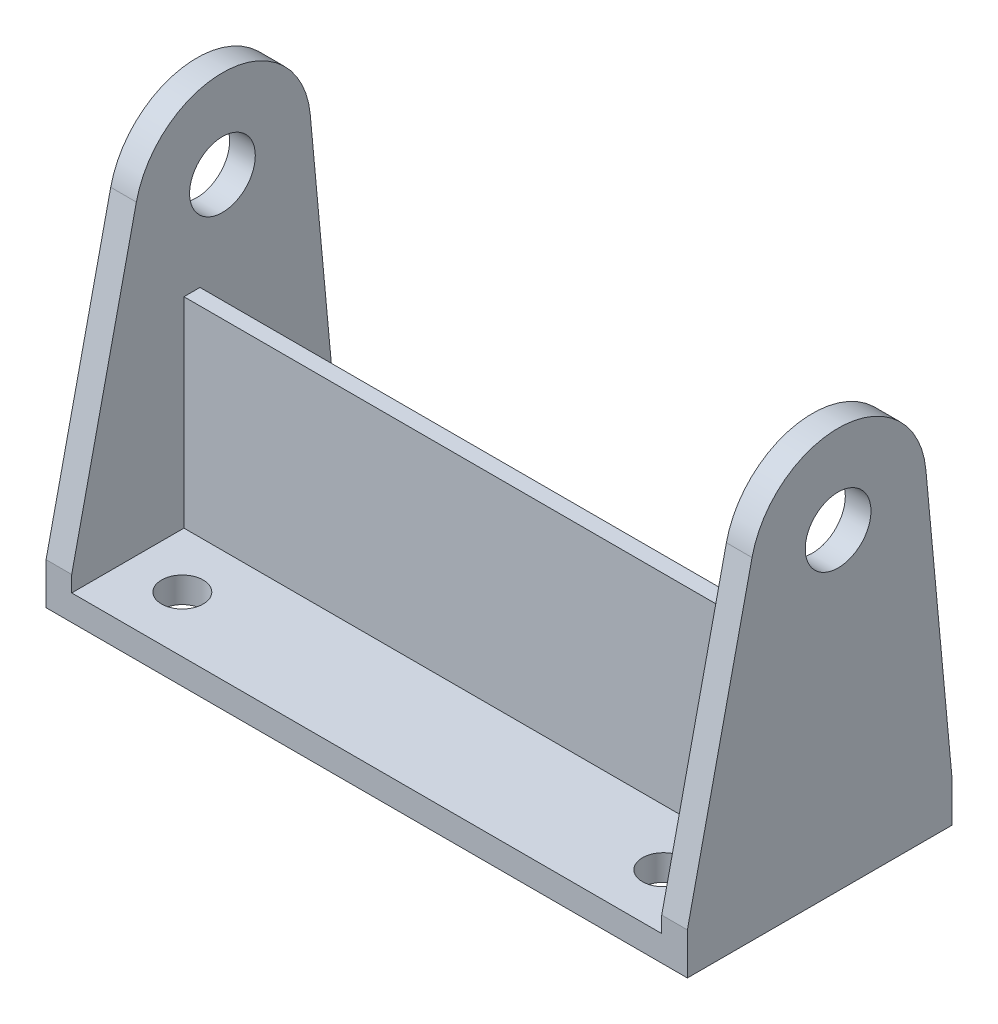
ISO-10303-21;
HEADER;
FILE_DESCRIPTION(('STEP AP214'),'2;1');
FILE_NAME('part.step','',(''),(''),'','','');
FILE_SCHEMA(('AUTOMOTIVE_DESIGN { 1 0 10303 214 1 1 1 1 }'));
ENDSEC;
DATA;
#1=APPLICATION_CONTEXT('core data for automotive mechanical design processes');
#2=APPLICATION_PROTOCOL_DEFINITION('international standard','automotive_design',2000,#1);
#3=PRODUCT_CONTEXT('',#1,'mechanical');
#4=PRODUCT('Part','Part','',(#3));
#5=PRODUCT_RELATED_PRODUCT_CATEGORY('part','',(#4));
#6=PRODUCT_DEFINITION_FORMATION('','',#4);
#7=PRODUCT_DEFINITION_CONTEXT('part definition',#1,'design');
#8=PRODUCT_DEFINITION('design','',#6,#7);
#9=PRODUCT_DEFINITION_SHAPE('','',#8);
#10=(LENGTH_UNIT() NAMED_UNIT(*) SI_UNIT(.MILLI.,.METRE.));
#11=(NAMED_UNIT(*) PLANE_ANGLE_UNIT() SI_UNIT($,.RADIAN.));
#12=(NAMED_UNIT(*) SI_UNIT($,.STERADIAN.) SOLID_ANGLE_UNIT());
#13=UNCERTAINTY_MEASURE_WITH_UNIT(LENGTH_MEASURE(1.E-05),#10,'distance_accuracy_value','');
#14=(GEOMETRIC_REPRESENTATION_CONTEXT(3) GLOBAL_UNCERTAINTY_ASSIGNED_CONTEXT((#13)) GLOBAL_UNIT_ASSIGNED_CONTEXT((#10,
#11,#12)) REPRESENTATION_CONTEXT('',''));
#15=CARTESIAN_POINT('',(0.,0.,0.));
#16=DIRECTION('',(0.,0.,1.));
#17=DIRECTION('',(1.,0.,0.));
#18=AXIS2_PLACEMENT_3D('',#15,#16,#17);
#19=CARTESIAN_POINT('',(0.,16.,0.));
#20=DIRECTION('',(0.,-1.,0.));
#21=DIRECTION('',(0.,0.,-1.));
#22=AXIS2_PLACEMENT_3D('',#19,#20,#21);
#23=PLANE('',#22);
#24=CARTESIAN_POINT('',(350.,16.,-115.));
#25=DIRECTION('',(0.,1.,0.));
#26=DIRECTION('',(0.,0.,1.));
#27=AXIS2_PLACEMENT_3D('',#24,#25,#26);
#28=CIRCLE('',#27,13.);
#29=CARTESIAN_POINT('',(350.,16.,-102.));
#30=VERTEX_POINT('',#29);
#31=EDGE_CURVE('E285',#30,#30,#28,.T.);
#32=ORIENTED_EDGE('',*,*,#31,.F.);
#33=EDGE_LOOP('',(#32));
#34=FACE_BOUND('',#33,.T.);
#35=CARTESIAN_POINT('',(50.,16.,-115.));
#36=DIRECTION('',(0.,1.,0.));
#37=DIRECTION('',(0.,0.,1.));
#38=AXIS2_PLACEMENT_3D('',#35,#36,#37);
#39=CIRCLE('',#38,13.);
#40=CARTESIAN_POINT('',(50.,16.,-102.));
#41=VERTEX_POINT('',#40);
#42=EDGE_CURVE('E279',#41,#41,#39,.T.);
#43=ORIENTED_EDGE('',*,*,#42,.F.);
#44=EDGE_LOOP('',(#43));
#45=FACE_BOUND('',#44,.T.);
#46=DIRECTION('',(-1.,0.,0.));
#47=VECTOR('',#46,1.);
#48=CARTESIAN_POINT('',(0.,16.,-165.));
#49=LINE('',#48,#47);
#50=CARTESIAN_POINT('',(384.,16.,-165.));
#51=VERTEX_POINT('',#50);
#52=CARTESIAN_POINT('',(16.,16.,-165.));
#53=VERTEX_POINT('',#52);
#54=EDGE_CURVE('E292',#51,#53,#49,.T.);
#55=ORIENTED_EDGE('',*,*,#54,.T.);
#56=DIRECTION('',(0.,0.,-1.));
#57=VECTOR('',#56,1.);
#58=CARTESIAN_POINT('',(16.,16.,-165.));
#59=LINE('',#58,#57);
#60=CARTESIAN_POINT('',(16.,16.,-80.));
#61=VERTEX_POINT('',#60);
#62=EDGE_CURVE('E186',#61,#53,#59,.T.);
#63=ORIENTED_EDGE('',*,*,#62,.F.);
#64=DIRECTION('',(-1.,0.,0.));
#65=VECTOR('',#64,1.);
#66=CARTESIAN_POINT('',(16.,16.,-80.));
#67=LINE('',#66,#65);
#68=CARTESIAN_POINT('',(384.,16.,-80.));
#69=VERTEX_POINT('',#68);
#70=EDGE_CURVE('E243',#69,#61,#67,.T.);
#71=ORIENTED_EDGE('',*,*,#70,.F.);
#72=DIRECTION('',(0.,0.,-1.));
#73=VECTOR('',#72,1.);
#74=CARTESIAN_POINT('',(384.,16.,-165.));
#75=LINE('',#74,#73);
#76=EDGE_CURVE('E202',#69,#51,#75,.T.);
#77=ORIENTED_EDGE('',*,*,#76,.T.);
#78=EDGE_LOOP('',(#55,#63,#71,#77));
#79=FACE_BOUND('',#78,.T.);
#80=ADVANCED_FACE('F34',(#34,#45,#79),#23,.F.);
#81=CARTESIAN_POINT('',(350.,16.,-35.));
#82=DIRECTION('',(0.,1.,0.));
#83=DIRECTION('',(0.,0.,1.));
#84=AXIS2_PLACEMENT_3D('',#81,#82,#83);
#85=CIRCLE('',#84,13.);
#86=CARTESIAN_POINT('',(350.,16.,-22.));
#87=VERTEX_POINT('',#86);
#88=EDGE_CURVE('E267',#87,#87,#85,.T.);
#89=ORIENTED_EDGE('',*,*,#88,.F.);
#90=EDGE_LOOP('',(#89));
#91=FACE_BOUND('',#90,.T.);
#92=CARTESIAN_POINT('',(50.,16.,-35.));
#93=DIRECTION('',(0.,1.,0.));
#94=DIRECTION('',(0.,0.,1.));
#95=AXIS2_PLACEMENT_3D('',#92,#93,#94);
#96=CIRCLE('',#95,13.);
#97=CARTESIAN_POINT('',(50.,16.,-22.));
#98=VERTEX_POINT('',#97);
#99=EDGE_CURVE('E273',#98,#98,#96,.T.);
#100=ORIENTED_EDGE('',*,*,#99,.F.);
#101=EDGE_LOOP('',(#100));
#102=FACE_BOUND('',#101,.T.);
#103=DIRECTION('',(1.,0.,0.));
#104=VECTOR('',#103,1.);
#105=CARTESIAN_POINT('',(16.,16.,-70.));
#106=LINE('',#105,#104);
#107=CARTESIAN_POINT('',(16.,16.,-70.));
#108=VERTEX_POINT('',#107);
#109=CARTESIAN_POINT('',(384.,16.,-70.));
#110=VERTEX_POINT('',#109);
#111=EDGE_CURVE('E238',#108,#110,#106,.T.);
#112=ORIENTED_EDGE('',*,*,#111,.F.);
#113=CARTESIAN_POINT('',(16.,16.,0.));
#114=VERTEX_POINT('',#113);
#115=EDGE_CURVE('E184',#114,#108,#59,.T.);
#116=ORIENTED_EDGE('',*,*,#115,.F.);
#117=DIRECTION('',(1.,0.,0.));
#118=VECTOR('',#117,1.);
#119=CARTESIAN_POINT('',(0.,16.,0.));
#120=LINE('',#119,#118);
#121=CARTESIAN_POINT('',(384.,16.,0.));
#122=VERTEX_POINT('',#121);
#123=EDGE_CURVE('E290',#114,#122,#120,.T.);
#124=ORIENTED_EDGE('',*,*,#123,.T.);
#125=EDGE_CURVE('E214',#122,#110,#75,.T.);
#126=ORIENTED_EDGE('',*,*,#125,.T.);
#127=EDGE_LOOP('',(#112,#116,#124,#126));
#128=FACE_BOUND('',#127,.T.);
#129=ADVANCED_FACE('F311',(#91,#102,#128),#23,.F.);
#130=CARTESIAN_POINT('',(0.,0.,0.));
#131=DIRECTION('',(0.,-1.,0.));
#132=DIRECTION('',(0.,0.,-1.));
#133=AXIS2_PLACEMENT_3D('',#130,#131,#132);
#134=PLANE('',#133);
#135=CARTESIAN_POINT('',(50.,0.,-35.));
#136=DIRECTION('',(0.,1.,0.));
#137=DIRECTION('',(0.,0.,1.));
#138=AXIS2_PLACEMENT_3D('',#135,#136,#137);
#139=CIRCLE('',#138,13.);
#140=CARTESIAN_POINT('',(50.,0.,-22.));
#141=VERTEX_POINT('',#140);
#142=EDGE_CURVE('E270',#141,#141,#139,.T.);
#143=ORIENTED_EDGE('',*,*,#142,.T.);
#144=EDGE_LOOP('',(#143));
#145=FACE_BOUND('',#144,.T.);
#146=CARTESIAN_POINT('',(350.,0.,-115.));
#147=DIRECTION('',(0.,1.,0.));
#148=DIRECTION('',(0.,0.,1.));
#149=AXIS2_PLACEMENT_3D('',#146,#147,#148);
#150=CIRCLE('',#149,13.);
#151=CARTESIAN_POINT('',(350.,0.,-102.));
#152=VERTEX_POINT('',#151);
#153=EDGE_CURVE('E282',#152,#152,#150,.T.);
#154=ORIENTED_EDGE('',*,*,#153,.T.);
#155=EDGE_LOOP('',(#154));
#156=FACE_BOUND('',#155,.T.);
#157=DIRECTION('',(0.,0.,1.));
#158=VECTOR('',#157,1.);
#159=CARTESIAN_POINT('',(0.,0.,0.));
#160=LINE('',#159,#158);
#161=CARTESIAN_POINT('',(0.,0.,-165.));
#162=VERTEX_POINT('',#161);
#163=CARTESIAN_POINT('',(0.,0.,0.));
#164=VERTEX_POINT('',#163);
#165=EDGE_CURVE('E155',#162,#164,#160,.T.);
#166=ORIENTED_EDGE('',*,*,#165,.F.);
#167=DIRECTION('',(-1.,0.,0.));
#168=VECTOR('',#167,1.);
#169=CARTESIAN_POINT('',(0.,0.,-165.));
#170=LINE('',#169,#168);
#171=CARTESIAN_POINT('',(400.,0.,-165.));
#172=VERTEX_POINT('',#171);
#173=EDGE_CURVE('E49',#172,#162,#170,.T.);
#174=ORIENTED_EDGE('',*,*,#173,.F.);
#175=DIRECTION('',(0.,0.,-1.));
#176=VECTOR('',#175,1.);
#177=CARTESIAN_POINT('',(400.,0.,0.));
#178=LINE('',#177,#176);
#179=CARTESIAN_POINT('',(400.,0.,0.));
#180=VERTEX_POINT('',#179);
#181=EDGE_CURVE('E57',#180,#172,#178,.T.);
#182=ORIENTED_EDGE('',*,*,#181,.F.);
#183=DIRECTION('',(1.,0.,0.));
#184=VECTOR('',#183,1.);
#185=CARTESIAN_POINT('',(0.,0.,0.));
#186=LINE('',#185,#184);
#187=EDGE_CURVE('E297',#164,#180,#186,.T.);
#188=ORIENTED_EDGE('',*,*,#187,.F.);
#189=EDGE_LOOP('',(#166,#174,#182,#188));
#190=FACE_BOUND('',#189,.T.);
#191=CARTESIAN_POINT('',(50.,0.,-115.));
#192=DIRECTION('',(0.,1.,0.));
#193=DIRECTION('',(0.,0.,1.));
#194=AXIS2_PLACEMENT_3D('',#191,#192,#193);
#195=CIRCLE('',#194,13.);
#196=CARTESIAN_POINT('',(50.,0.,-102.));
#197=VERTEX_POINT('',#196);
#198=EDGE_CURVE('E276',#197,#197,#195,.T.);
#199=ORIENTED_EDGE('',*,*,#198,.T.);
#200=EDGE_LOOP('',(#199));
#201=FACE_BOUND('',#200,.T.);
#202=CARTESIAN_POINT('',(350.,0.,-35.));
#203=DIRECTION('',(0.,1.,0.));
#204=DIRECTION('',(0.,0.,1.));
#205=AXIS2_PLACEMENT_3D('',#202,#203,#204);
#206=CIRCLE('',#205,13.);
#207=CARTESIAN_POINT('',(350.,0.,-22.));
#208=VERTEX_POINT('',#207);
#209=EDGE_CURVE('E266',#208,#208,#206,.T.);
#210=ORIENTED_EDGE('',*,*,#209,.T.);
#211=EDGE_LOOP('',(#210));
#212=FACE_BOUND('',#211,.T.);
#213=ADVANCED_FACE('F308',(#145,#156,#190,#201,#212),#134,.T.);
#214=CARTESIAN_POINT('',(0.,16.,0.));
#215=DIRECTION('',(1.,0.,0.));
#216=DIRECTION('',(0.,0.,-1.));
#217=AXIS2_PLACEMENT_3D('',#214,#215,#216);
#218=PLANE('',#217);
#219=ORIENTED_EDGE('',*,*,#165,.T.);
#220=DIRECTION('',(0.,-1.,0.));
#221=VECTOR('',#220,1.);
#222=CARTESIAN_POINT('',(0.,16.,0.));
#223=LINE('',#222,#221);
#224=CARTESIAN_POINT('',(0.,26.,0.));
#225=VERTEX_POINT('',#224);
#226=EDGE_CURVE('E11',#225,#164,#223,.T.);
#227=ORIENTED_EDGE('',*,*,#226,.F.);
#228=DIRECTION('',(0.,-0.976069505597382,0.217458778261266));
#229=VECTOR('',#228,1.);
#230=CARTESIAN_POINT('',(0.,206.96023280437,-40.316177192144));
#231=LINE('',#230,#229);
#232=CARTESIAN_POINT('',(0.,206.96023280437,-40.316177192144));
#233=VERTEX_POINT('',#232);
#234=EDGE_CURVE('E152',#233,#225,#231,.T.);
#235=ORIENTED_EDGE('',*,*,#234,.F.);
#236=CARTESIAN_POINT('',(0.,195.,-94.));
#237=DIRECTION('',(1.,0.,0.));
#238=DIRECTION('',(0.,0.,1.));
#239=AXIS2_PLACEMENT_3D('',#236,#237,#238);
#240=CIRCLE('',#239,55.);
#241=CARTESIAN_POINT('',(0.,200.107262875212,-148.762358111421));
#242=VERTEX_POINT('',#241);
#243=EDGE_CURVE('E169',#242,#233,#240,.T.);
#244=ORIENTED_EDGE('',*,*,#243,.F.);
#245=DIRECTION('',(0.,0.995679238389466,0.0928593250038585));
#246=VECTOR('',#245,1.);
#247=CARTESIAN_POINT('',(0.,26.,-165.));
#248=LINE('',#247,#246);
#249=CARTESIAN_POINT('',(0.,26.,-165.));
#250=VERTEX_POINT('',#249);
#251=EDGE_CURVE('E172',#250,#242,#248,.T.);
#252=ORIENTED_EDGE('',*,*,#251,.F.);
#253=DIRECTION('',(0.,-1.,0.));
#254=VECTOR('',#253,1.);
#255=CARTESIAN_POINT('',(0.,16.,-165.));
#256=LINE('',#255,#254);
#257=EDGE_CURVE('E295',#250,#162,#256,.T.);
#258=ORIENTED_EDGE('',*,*,#257,.T.);
#259=EDGE_LOOP('',(#219,#227,#235,#244,#252,#258));
#260=FACE_BOUND('',#259,.T.);
#261=CARTESIAN_POINT('',(0.,195.,-94.));
#262=DIRECTION('',(1.,0.,0.));
#263=DIRECTION('',(0.,0.,-1.));
#264=AXIS2_PLACEMENT_3D('',#261,#262,#263);
#265=CIRCLE('',#264,20.5);
#266=CARTESIAN_POINT('',(0.,195.,-114.5));
#267=VERTEX_POINT('',#266);
#268=EDGE_CURVE('E543',#267,#267,#265,.T.);
#269=ORIENTED_EDGE('',*,*,#268,.T.);
#270=EDGE_LOOP('',(#269));
#271=FACE_BOUND('',#270,.T.);
#272=ADVANCED_FACE('F36',(#260,#271),#218,.F.);
#273=CARTESIAN_POINT('',(0.,16.,0.));
#274=DIRECTION('',(0.,0.,-1.));
#275=DIRECTION('',(-1.,0.,0.));
#276=AXIS2_PLACEMENT_3D('',#273,#274,#275);
#277=PLANE('',#276);
#278=ORIENTED_EDGE('',*,*,#187,.T.);
#279=DIRECTION('',(0.,-1.,0.));
#280=VECTOR('',#279,1.);
#281=CARTESIAN_POINT('',(400.,16.,0.));
#282=LINE('',#281,#280);
#283=CARTESIAN_POINT('',(400.,26.,0.));
#284=VERTEX_POINT('',#283);
#285=EDGE_CURVE('E42',#284,#180,#282,.T.);
#286=ORIENTED_EDGE('',*,*,#285,.F.);
#287=DIRECTION('',(-1.,0.,0.));
#288=VECTOR('',#287,1.);
#289=CARTESIAN_POINT('',(400.,26.,0.));
#290=LINE('',#289,#288);
#291=CARTESIAN_POINT('',(384.,26.,0.));
#292=VERTEX_POINT('',#291);
#293=EDGE_CURVE('E213',#284,#292,#290,.T.);
#294=ORIENTED_EDGE('',*,*,#293,.T.);
#295=DIRECTION('',(0.,-1.,0.));
#296=VECTOR('',#295,1.);
#297=CARTESIAN_POINT('',(384.,16.,0.));
#298=LINE('',#297,#296);
#299=EDGE_CURVE('E208',#292,#122,#298,.T.);
#300=ORIENTED_EDGE('',*,*,#299,.T.);
#301=ORIENTED_EDGE('',*,*,#123,.F.);
#302=DIRECTION('',(0.,-1.,0.));
#303=VECTOR('',#302,1.);
#304=CARTESIAN_POINT('',(16.,16.,0.));
#305=LINE('',#304,#303);
#306=CARTESIAN_POINT('',(16.,26.,0.));
#307=VERTEX_POINT('',#306);
#308=EDGE_CURVE('E161',#307,#114,#305,.T.);
#309=ORIENTED_EDGE('',*,*,#308,.F.);
#310=DIRECTION('',(1.,0.,0.));
#311=VECTOR('',#310,1.);
#312=CARTESIAN_POINT('',(0.,26.,0.));
#313=LINE('',#312,#311);
#314=EDGE_CURVE('E158',#225,#307,#313,.T.);
#315=ORIENTED_EDGE('',*,*,#314,.F.);
#316=ORIENTED_EDGE('',*,*,#226,.T.);
#317=EDGE_LOOP('',(#278,#286,#294,#300,#301,#309,#315,#316));
#318=FACE_BOUND('',#317,.T.);
#319=ADVANCED_FACE('F159',(#318),#277,.F.);
#320=CARTESIAN_POINT('',(400.,16.,0.));
#321=DIRECTION('',(-1.,0.,0.));
#322=DIRECTION('',(0.,0.,1.));
#323=AXIS2_PLACEMENT_3D('',#320,#321,#322);
#324=PLANE('',#323);
#325=ORIENTED_EDGE('',*,*,#181,.T.);
#326=DIRECTION('',(0.,-1.,0.));
#327=VECTOR('',#326,1.);
#328=CARTESIAN_POINT('',(400.,16.,-165.));
#329=LINE('',#328,#327);
#330=CARTESIAN_POINT('',(400.,26.,-165.));
#331=VERTEX_POINT('',#330);
#332=EDGE_CURVE('E302',#331,#172,#329,.T.);
#333=ORIENTED_EDGE('',*,*,#332,.F.);
#334=DIRECTION('',(0.,0.995679238389466,0.0928593250038585));
#335=VECTOR('',#334,1.);
#336=CARTESIAN_POINT('',(400.,26.,-165.));
#337=LINE('',#336,#335);
#338=CARTESIAN_POINT('',(400.,200.107262875212,-148.762358111421));
#339=VERTEX_POINT('',#338);
#340=EDGE_CURVE('E205',#331,#339,#337,.T.);
#341=ORIENTED_EDGE('',*,*,#340,.T.);
#342=CARTESIAN_POINT('',(400.,195.,-94.));
#343=DIRECTION('',(1.,0.,0.));
#344=DIRECTION('',(0.,0.,1.));
#345=AXIS2_PLACEMENT_3D('',#342,#343,#344);
#346=CIRCLE('',#345,55.);
#347=CARTESIAN_POINT('',(400.,206.96023280437,-40.316177192144));
#348=VERTEX_POINT('',#347);
#349=EDGE_CURVE('E207',#339,#348,#346,.T.);
#350=ORIENTED_EDGE('',*,*,#349,.T.);
#351=DIRECTION('',(0.,-0.976069505597382,0.217458778261266));
#352=VECTOR('',#351,1.);
#353=CARTESIAN_POINT('',(400.,206.96023280437,-40.316177192144));
#354=LINE('',#353,#352);
#355=EDGE_CURVE('E210',#348,#284,#354,.T.);
#356=ORIENTED_EDGE('',*,*,#355,.T.);
#357=ORIENTED_EDGE('',*,*,#285,.T.);
#358=EDGE_LOOP('',(#325,#333,#341,#350,#356,#357));
#359=FACE_BOUND('',#358,.T.);
#360=CARTESIAN_POINT('',(400.,195.,-94.));
#361=DIRECTION('',(1.,0.,0.));
#362=DIRECTION('',(0.,0.,-1.));
#363=AXIS2_PLACEMENT_3D('',#360,#361,#362);
#364=CIRCLE('',#363,20.5);
#365=CARTESIAN_POINT('',(400.,195.,-114.5));
#366=VERTEX_POINT('',#365);
#367=EDGE_CURVE('E199',#366,#366,#364,.T.);
#368=ORIENTED_EDGE('',*,*,#367,.F.);
#369=EDGE_LOOP('',(#368));
#370=FACE_BOUND('',#369,.T.);
#371=ADVANCED_FACE('F303',(#359,#370),#324,.F.);
#372=CARTESIAN_POINT('',(0.,16.,-165.));
#373=DIRECTION('',(0.,0.,1.));
#374=DIRECTION('',(1.,0.,0.));
#375=AXIS2_PLACEMENT_3D('',#372,#373,#374);
#376=PLANE('',#375);
#377=ORIENTED_EDGE('',*,*,#173,.T.);
#378=ORIENTED_EDGE('',*,*,#257,.F.);
#379=DIRECTION('',(1.,0.,0.));
#380=VECTOR('',#379,1.);
#381=CARTESIAN_POINT('',(0.,26.,-165.));
#382=LINE('',#381,#380);
#383=CARTESIAN_POINT('',(16.,26.,-165.));
#384=VERTEX_POINT('',#383);
#385=EDGE_CURVE('E183',#250,#384,#382,.T.);
#386=ORIENTED_EDGE('',*,*,#385,.T.);
#387=DIRECTION('',(0.,1.,0.));
#388=VECTOR('',#387,1.);
#389=CARTESIAN_POINT('',(16.,16.,-165.));
#390=LINE('',#389,#388);
#391=EDGE_CURVE('E170',#53,#384,#390,.T.);
#392=ORIENTED_EDGE('',*,*,#391,.F.);
#393=ORIENTED_EDGE('',*,*,#54,.F.);
#394=DIRECTION('',(0.,1.,0.));
#395=VECTOR('',#394,1.);
#396=CARTESIAN_POINT('',(384.,16.,-165.));
#397=LINE('',#396,#395);
#398=CARTESIAN_POINT('',(384.,26.,-165.));
#399=VERTEX_POINT('',#398);
#400=EDGE_CURVE('E217',#51,#399,#397,.T.);
#401=ORIENTED_EDGE('',*,*,#400,.T.);
#402=DIRECTION('',(-1.,0.,0.));
#403=VECTOR('',#402,1.);
#404=CARTESIAN_POINT('',(400.,26.,-165.));
#405=LINE('',#404,#403);
#406=EDGE_CURVE('E235',#331,#399,#405,.T.);
#407=ORIENTED_EDGE('',*,*,#406,.F.);
#408=ORIENTED_EDGE('',*,*,#332,.T.);
#409=EDGE_LOOP('',(#377,#378,#386,#392,#393,#401,#407,#408));
#410=FACE_BOUND('',#409,.T.);
#411=ADVANCED_FACE('F347',(#410),#376,.F.);
#412=CARTESIAN_POINT('',(350.,16.,-115.));
#413=DIRECTION('',(0.,-1.,0.));
#414=DIRECTION('',(0.,0.,-1.));
#415=AXIS2_PLACEMENT_3D('',#412,#413,#414);
#416=CYLINDRICAL_SURFACE('',#415,13.);
#417=ORIENTED_EDGE('',*,*,#31,.T.);
#418=EDGE_LOOP('',(#417));
#419=FACE_BOUND('',#418,.T.);
#420=ORIENTED_EDGE('',*,*,#153,.F.);
#421=EDGE_LOOP('',(#420));
#422=FACE_BOUND('',#421,.T.);
#423=ADVANCED_FACE('F344',(#419,#422),#416,.F.);
#424=CARTESIAN_POINT('',(50.,16.,-115.));
#425=DIRECTION('',(0.,-1.,0.));
#426=DIRECTION('',(0.,0.,-1.));
#427=AXIS2_PLACEMENT_3D('',#424,#425,#426);
#428=CYLINDRICAL_SURFACE('',#427,13.);
#429=ORIENTED_EDGE('',*,*,#42,.T.);
#430=EDGE_LOOP('',(#429));
#431=FACE_BOUND('',#430,.T.);
#432=ORIENTED_EDGE('',*,*,#198,.F.);
#433=EDGE_LOOP('',(#432));
#434=FACE_BOUND('',#433,.T.);
#435=ADVANCED_FACE('F331',(#431,#434),#428,.F.);
#436=CARTESIAN_POINT('',(50.,16.,-35.));
#437=DIRECTION('',(0.,-1.,0.));
#438=DIRECTION('',(0.,0.,-1.));
#439=AXIS2_PLACEMENT_3D('',#436,#437,#438);
#440=CYLINDRICAL_SURFACE('',#439,13.);
#441=ORIENTED_EDGE('',*,*,#99,.T.);
#442=EDGE_LOOP('',(#441));
#443=FACE_BOUND('',#442,.T.);
#444=ORIENTED_EDGE('',*,*,#142,.F.);
#445=EDGE_LOOP('',(#444));
#446=FACE_BOUND('',#445,.T.);
#447=ADVANCED_FACE('F321',(#443,#446),#440,.F.);
#448=CARTESIAN_POINT('',(350.,16.,-35.));
#449=DIRECTION('',(0.,-1.,0.));
#450=DIRECTION('',(0.,0.,-1.));
#451=AXIS2_PLACEMENT_3D('',#448,#449,#450);
#452=CYLINDRICAL_SURFACE('',#451,13.);
#453=ORIENTED_EDGE('',*,*,#88,.T.);
#454=EDGE_LOOP('',(#453));
#455=FACE_BOUND('',#454,.T.);
#456=ORIENTED_EDGE('',*,*,#209,.F.);
#457=EDGE_LOOP('',(#456));
#458=FACE_BOUND('',#457,.T.);
#459=ADVANCED_FACE('F318',(#455,#458),#452,.F.);
#460=CARTESIAN_POINT('',(16.,141.,-70.));
#461=DIRECTION('',(0.,0.,-1.));
#462=DIRECTION('',(-1.,0.,0.));
#463=AXIS2_PLACEMENT_3D('',#460,#461,#462);
#464=PLANE('',#463);
#465=ORIENTED_EDGE('',*,*,#111,.T.);
#466=DIRECTION('',(0.,-1.,0.));
#467=VECTOR('',#466,1.);
#468=CARTESIAN_POINT('',(384.,141.,-70.));
#469=LINE('',#468,#467);
#470=CARTESIAN_POINT('',(384.,141.,-70.));
#471=VERTEX_POINT('',#470);
#472=EDGE_CURVE('E261',#471,#110,#469,.T.);
#473=ORIENTED_EDGE('',*,*,#472,.F.);
#474=DIRECTION('',(1.,0.,0.));
#475=VECTOR('',#474,1.);
#476=CARTESIAN_POINT('',(16.,141.,-70.));
#477=LINE('',#476,#475);
#478=CARTESIAN_POINT('',(16.,141.,-70.));
#479=VERTEX_POINT('',#478);
#480=EDGE_CURVE('E242',#479,#471,#477,.T.);
#481=ORIENTED_EDGE('',*,*,#480,.F.);
#482=DIRECTION('',(0.,-1.,0.));
#483=VECTOR('',#482,1.);
#484=CARTESIAN_POINT('',(16.,141.,-70.));
#485=LINE('',#484,#483);
#486=EDGE_CURVE('E263',#479,#108,#485,.T.);
#487=ORIENTED_EDGE('',*,*,#486,.T.);
#488=EDGE_LOOP('',(#465,#473,#481,#487));
#489=FACE_BOUND('',#488,.T.);
#490=ADVANCED_FACE('F320',(#489),#464,.F.);
#491=CARTESIAN_POINT('',(16.,141.,-80.));
#492=DIRECTION('',(0.,0.,1.));
#493=DIRECTION('',(1.,0.,0.));
#494=AXIS2_PLACEMENT_3D('',#491,#492,#493);
#495=PLANE('',#494);
#496=ORIENTED_EDGE('',*,*,#70,.T.);
#497=DIRECTION('',(0.,-1.,0.));
#498=VECTOR('',#497,1.);
#499=CARTESIAN_POINT('',(16.,141.,-80.));
#500=LINE('',#499,#498);
#501=CARTESIAN_POINT('',(16.,141.,-80.));
#502=VERTEX_POINT('',#501);
#503=EDGE_CURVE('E252',#502,#61,#500,.T.);
#504=ORIENTED_EDGE('',*,*,#503,.F.);
#505=DIRECTION('',(-1.,0.,0.));
#506=VECTOR('',#505,1.);
#507=CARTESIAN_POINT('',(16.,141.,-80.));
#508=LINE('',#507,#506);
#509=CARTESIAN_POINT('',(384.,141.,-80.));
#510=VERTEX_POINT('',#509);
#511=EDGE_CURVE('E249',#510,#502,#508,.T.);
#512=ORIENTED_EDGE('',*,*,#511,.F.);
#513=DIRECTION('',(0.,-1.,0.));
#514=VECTOR('',#513,1.);
#515=CARTESIAN_POINT('',(384.,141.,-80.));
#516=LINE('',#515,#514);
#517=EDGE_CURVE('E258',#510,#69,#516,.T.);
#518=ORIENTED_EDGE('',*,*,#517,.T.);
#519=EDGE_LOOP('',(#496,#504,#512,#518));
#520=FACE_BOUND('',#519,.T.);
#521=ADVANCED_FACE('F328',(#520),#495,.F.);
#522=CARTESIAN_POINT('',(0.,141.,0.));
#523=DIRECTION('',(0.,1.,0.));
#524=DIRECTION('',(0.,0.,1.));
#525=AXIS2_PLACEMENT_3D('',#522,#523,#524);
#526=PLANE('',#525);
#527=DIRECTION('',(0.,0.,1.));
#528=VECTOR('',#527,1.);
#529=CARTESIAN_POINT('',(16.,141.,-80.));
#530=LINE('',#529,#528);
#531=EDGE_CURVE('E239',#502,#479,#530,.T.);
#532=ORIENTED_EDGE('',*,*,#531,.T.);
#533=ORIENTED_EDGE('',*,*,#480,.T.);
#534=DIRECTION('',(0.,0.,-1.));
#535=VECTOR('',#534,1.);
#536=CARTESIAN_POINT('',(384.,141.,-80.));
#537=LINE('',#536,#535);
#538=EDGE_CURVE('E246',#471,#510,#537,.T.);
#539=ORIENTED_EDGE('',*,*,#538,.T.);
#540=ORIENTED_EDGE('',*,*,#511,.T.);
#541=EDGE_LOOP('',(#532,#533,#539,#540));
#542=FACE_BOUND('',#541,.T.);
#543=ADVANCED_FACE('F424',(#542),#526,.T.);
#544=CARTESIAN_POINT('',(384.,195.,-94.));
#545=DIRECTION('',(-1.,0.,0.));
#546=DIRECTION('',(0.,0.,1.));
#547=AXIS2_PLACEMENT_3D('',#544,#545,#546);
#548=PLANE('',#547);
#549=CARTESIAN_POINT('',(384.,195.,-94.));
#550=DIRECTION('',(1.,0.,0.));
#551=DIRECTION('',(0.,0.,-1.));
#552=AXIS2_PLACEMENT_3D('',#549,#550,#551);
#553=CIRCLE('',#552,20.5);
#554=CARTESIAN_POINT('',(384.,195.,-114.5));
#555=VERTEX_POINT('',#554);
#556=EDGE_CURVE('E165',#555,#555,#553,.T.);
#557=ORIENTED_EDGE('',*,*,#556,.T.);
#558=EDGE_LOOP('',(#557));
#559=FACE_BOUND('',#558,.T.);
#560=ORIENTED_EDGE('',*,*,#472,.T.);
#561=ORIENTED_EDGE('',*,*,#125,.F.);
#562=ORIENTED_EDGE('',*,*,#299,.F.);
#563=DIRECTION('',(0.,-0.976069505597382,0.217458778261266));
#564=VECTOR('',#563,1.);
#565=CARTESIAN_POINT('',(384.,206.96023280437,-40.316177192144));
#566=LINE('',#565,#564);
#567=CARTESIAN_POINT('',(384.,206.96023280437,-40.316177192144));
#568=VERTEX_POINT('',#567);
#569=EDGE_CURVE('E223',#568,#292,#566,.T.);
#570=ORIENTED_EDGE('',*,*,#569,.F.);
#571=CARTESIAN_POINT('',(384.,195.,-94.));
#572=DIRECTION('',(1.,0.,0.));
#573=DIRECTION('',(0.,0.,1.));
#574=AXIS2_PLACEMENT_3D('',#571,#572,#573);
#575=CIRCLE('',#574,55.);
#576=CARTESIAN_POINT('',(384.,200.107262875212,-148.762358111421));
#577=VERTEX_POINT('',#576);
#578=EDGE_CURVE('E221',#577,#568,#575,.T.);
#579=ORIENTED_EDGE('',*,*,#578,.F.);
#580=DIRECTION('',(0.,0.995679238389466,0.0928593250038585));
#581=VECTOR('',#580,1.);
#582=CARTESIAN_POINT('',(384.,26.,-165.));
#583=LINE('',#582,#581);
#584=EDGE_CURVE('E219',#399,#577,#583,.T.);
#585=ORIENTED_EDGE('',*,*,#584,.F.);
#586=ORIENTED_EDGE('',*,*,#400,.F.);
#587=ORIENTED_EDGE('',*,*,#76,.F.);
#588=ORIENTED_EDGE('',*,*,#517,.F.);
#589=ORIENTED_EDGE('',*,*,#538,.F.);
#590=EDGE_LOOP('',(#560,#561,#562,#570,#579,#585,#586,#587,#588,#589));
#591=FACE_BOUND('',#590,.T.);
#592=ADVANCED_FACE('F414',(#559,#591),#548,.T.);
#593=CARTESIAN_POINT('',(400.,26.,-165.));
#594=DIRECTION('',(0.,-0.0928593250038585,0.995679238389466));
#595=DIRECTION('',(0.,-0.995679238389466,-0.0928593250038585));
#596=AXIS2_PLACEMENT_3D('',#593,#594,#595);
#597=PLANE('',#596);
#598=ORIENTED_EDGE('',*,*,#584,.T.);
#599=DIRECTION('',(-1.,0.,0.));
#600=VECTOR('',#599,1.);
#601=CARTESIAN_POINT('',(400.,200.107262875212,-148.762358111421));
#602=LINE('',#601,#600);
#603=EDGE_CURVE('E232',#339,#577,#602,.T.);
#604=ORIENTED_EDGE('',*,*,#603,.F.);
#605=ORIENTED_EDGE('',*,*,#340,.F.);
#606=ORIENTED_EDGE('',*,*,#406,.T.);
#607=EDGE_LOOP('',(#598,#604,#605,#606));
#608=FACE_BOUND('',#607,.T.);
#609=ADVANCED_FACE('F404',(#608),#597,.F.);
#610=CARTESIAN_POINT('',(400.,195.,-94.));
#611=DIRECTION('',(-1.,0.,0.));
#612=DIRECTION('',(0.,0.,1.));
#613=AXIS2_PLACEMENT_3D('',#610,#611,#612);
#614=CYLINDRICAL_SURFACE('',#613,55.);
#615=ORIENTED_EDGE('',*,*,#578,.T.);
#616=DIRECTION('',(-1.,0.,0.));
#617=VECTOR('',#616,1.);
#618=CARTESIAN_POINT('',(400.,206.96023280437,-40.316177192144));
#619=LINE('',#618,#617);
#620=EDGE_CURVE('E229',#348,#568,#619,.T.);
#621=ORIENTED_EDGE('',*,*,#620,.F.);
#622=ORIENTED_EDGE('',*,*,#349,.F.);
#623=ORIENTED_EDGE('',*,*,#603,.T.);
#624=EDGE_LOOP('',(#615,#621,#622,#623));
#625=FACE_BOUND('',#624,.T.);
#626=ADVANCED_FACE('F394',(#625),#614,.T.);
#627=CARTESIAN_POINT('',(400.,206.96023280437,-40.316177192144));
#628=DIRECTION('',(0.,-0.217458778261266,-0.976069505597382));
#629=DIRECTION('',(0.,0.976069505597382,-0.217458778261266));
#630=AXIS2_PLACEMENT_3D('',#627,#628,#629);
#631=PLANE('',#630);
#632=ORIENTED_EDGE('',*,*,#569,.T.);
#633=ORIENTED_EDGE('',*,*,#293,.F.);
#634=ORIENTED_EDGE('',*,*,#355,.F.);
#635=ORIENTED_EDGE('',*,*,#620,.T.);
#636=EDGE_LOOP('',(#632,#633,#634,#635));
#637=FACE_BOUND('',#636,.T.);
#638=ADVANCED_FACE('F383',(#637),#631,.F.);
#639=CARTESIAN_POINT('',(400.,195.,-94.));
#640=DIRECTION('',(-1.,0.,0.));
#641=DIRECTION('',(0.,0.,1.));
#642=AXIS2_PLACEMENT_3D('',#639,#640,#641);
#643=CYLINDRICAL_SURFACE('',#642,20.5);
#644=ORIENTED_EDGE('',*,*,#367,.T.);
#645=EDGE_LOOP('',(#644));
#646=FACE_BOUND('',#645,.T.);
#647=ORIENTED_EDGE('',*,*,#556,.F.);
#648=EDGE_LOOP('',(#647));
#649=FACE_BOUND('',#648,.T.);
#650=ADVANCED_FACE('F378',(#646,#649),#643,.F.);
#651=CARTESIAN_POINT('',(16.,195.,-94.));
#652=DIRECTION('',(1.,0.,0.));
#653=DIRECTION('',(0.,0.,1.));
#654=AXIS2_PLACEMENT_3D('',#651,#652,#653);
#655=PLANE('',#654);
#656=CARTESIAN_POINT('',(16.,195.,-94.));
#657=DIRECTION('',(1.,0.,0.));
#658=DIRECTION('',(0.,0.,-1.));
#659=AXIS2_PLACEMENT_3D('',#656,#657,#658);
#660=CIRCLE('',#659,20.5);
#661=CARTESIAN_POINT('',(16.,195.,-114.5));
#662=VERTEX_POINT('',#661);
#663=EDGE_CURVE('E178',#662,#662,#660,.T.);
#664=ORIENTED_EDGE('',*,*,#663,.F.);
#665=EDGE_LOOP('',(#664));
#666=FACE_BOUND('',#665,.T.);
#667=ORIENTED_EDGE('',*,*,#486,.F.);
#668=ORIENTED_EDGE('',*,*,#531,.F.);
#669=ORIENTED_EDGE('',*,*,#503,.T.);
#670=ORIENTED_EDGE('',*,*,#62,.T.);
#671=ORIENTED_EDGE('',*,*,#391,.T.);
#672=DIRECTION('',(0.,0.995679238389466,0.0928593250038585));
#673=VECTOR('',#672,1.);
#674=CARTESIAN_POINT('',(16.,26.,-165.));
#675=LINE('',#674,#673);
#676=CARTESIAN_POINT('',(16.,200.107262875212,-148.762358111421));
#677=VERTEX_POINT('',#676);
#678=EDGE_CURVE('E175',#384,#677,#675,.T.);
#679=ORIENTED_EDGE('',*,*,#678,.T.);
#680=CARTESIAN_POINT('',(16.,195.,-94.));
#681=DIRECTION('',(1.,0.,0.));
#682=DIRECTION('',(0.,0.,1.));
#683=AXIS2_PLACEMENT_3D('',#680,#681,#682);
#684=CIRCLE('',#683,55.);
#685=CARTESIAN_POINT('',(16.,206.96023280437,-40.316177192144));
#686=VERTEX_POINT('',#685);
#687=EDGE_CURVE('E190',#677,#686,#684,.T.);
#688=ORIENTED_EDGE('',*,*,#687,.T.);
#689=DIRECTION('',(0.,-0.976069505597382,0.217458778261266));
#690=VECTOR('',#689,1.);
#691=CARTESIAN_POINT('',(16.,206.96023280437,-40.316177192144));
#692=LINE('',#691,#690);
#693=EDGE_CURVE('E188',#686,#307,#692,.T.);
#694=ORIENTED_EDGE('',*,*,#693,.T.);
#695=ORIENTED_EDGE('',*,*,#308,.T.);
#696=ORIENTED_EDGE('',*,*,#115,.T.);
#697=EDGE_LOOP('',(#667,#668,#669,#670,#671,#679,#688,#694,#695,#696));
#698=FACE_BOUND('',#697,.T.);
#699=ADVANCED_FACE('F382',(#666,#698),#655,.T.);
#700=CARTESIAN_POINT('',(0.,206.96023280437,-40.316177192144));
#701=DIRECTION('',(0.,0.217458778261266,0.976069505597382));
#702=DIRECTION('',(0.,-0.976069505597382,0.217458778261266));
#703=AXIS2_PLACEMENT_3D('',#700,#701,#702);
#704=PLANE('',#703);
#705=ORIENTED_EDGE('',*,*,#693,.F.);
#706=DIRECTION('',(1.,0.,0.));
#707=VECTOR('',#706,1.);
#708=CARTESIAN_POINT('',(0.,206.96023280437,-40.316177192144));
#709=LINE('',#708,#707);
#710=EDGE_CURVE('E166',#233,#686,#709,.T.);
#711=ORIENTED_EDGE('',*,*,#710,.F.);
#712=ORIENTED_EDGE('',*,*,#234,.T.);
#713=ORIENTED_EDGE('',*,*,#314,.T.);
#714=EDGE_LOOP('',(#705,#711,#712,#713));
#715=FACE_BOUND('',#714,.T.);
#716=ADVANCED_FACE('F168',(#715),#704,.T.);
#717=CARTESIAN_POINT('',(0.,195.,-94.));
#718=DIRECTION('',(1.,0.,0.));
#719=DIRECTION('',(0.,0.,-1.));
#720=AXIS2_PLACEMENT_3D('',#717,#718,#719);
#721=CYLINDRICAL_SURFACE('',#720,55.);
#722=ORIENTED_EDGE('',*,*,#687,.F.);
#723=DIRECTION('',(1.,0.,0.));
#724=VECTOR('',#723,1.);
#725=CARTESIAN_POINT('',(0.,200.107262875212,-148.762358111421));
#726=LINE('',#725,#724);
#727=EDGE_CURVE('E196',#242,#677,#726,.T.);
#728=ORIENTED_EDGE('',*,*,#727,.F.);
#729=ORIENTED_EDGE('',*,*,#243,.T.);
#730=ORIENTED_EDGE('',*,*,#710,.T.);
#731=EDGE_LOOP('',(#722,#728,#729,#730));
#732=FACE_BOUND('',#731,.T.);
#733=ADVANCED_FACE('F507',(#732),#721,.T.);
#734=CARTESIAN_POINT('',(0.,26.,-165.));
#735=DIRECTION('',(0.,0.0928593250038585,-0.995679238389466));
#736=DIRECTION('',(0.,0.995679238389466,0.0928593250038585));
#737=AXIS2_PLACEMENT_3D('',#734,#735,#736);
#738=PLANE('',#737);
#739=ORIENTED_EDGE('',*,*,#678,.F.);
#740=ORIENTED_EDGE('',*,*,#385,.F.);
#741=ORIENTED_EDGE('',*,*,#251,.T.);
#742=ORIENTED_EDGE('',*,*,#727,.T.);
#743=EDGE_LOOP('',(#739,#740,#741,#742));
#744=FACE_BOUND('',#743,.T.);
#745=ADVANCED_FACE('F516',(#744),#738,.T.);
#746=CARTESIAN_POINT('',(0.,195.,-94.));
#747=DIRECTION('',(1.,0.,0.));
#748=DIRECTION('',(0.,0.,-1.));
#749=AXIS2_PLACEMENT_3D('',#746,#747,#748);
#750=CYLINDRICAL_SURFACE('',#749,20.5);
#751=ORIENTED_EDGE('',*,*,#268,.F.);
#752=EDGE_LOOP('',(#751));
#753=FACE_BOUND('',#752,.T.);
#754=ORIENTED_EDGE('',*,*,#663,.T.);
#755=EDGE_LOOP('',(#754));
#756=FACE_BOUND('',#755,.T.);
#757=ADVANCED_FACE('F526',(#753,#756),#750,.F.);
#758=CLOSED_SHELL('',(#80,#129,#213,#272,#319,#371,#411,#423,#435,#447,#459,#490,#521,#543,#592,
#609,#626,#638,#650,#699,#716,#733,#745,#757));
#759=MANIFOLD_SOLID_BREP('B2',#758);
#760=ADVANCED_BREP_SHAPE_REPRESENTATION('',(#18,#759),#14);
#761=SHAPE_DEFINITION_REPRESENTATION(#9,#760);
ENDSEC;
END-ISO-10303-21;
